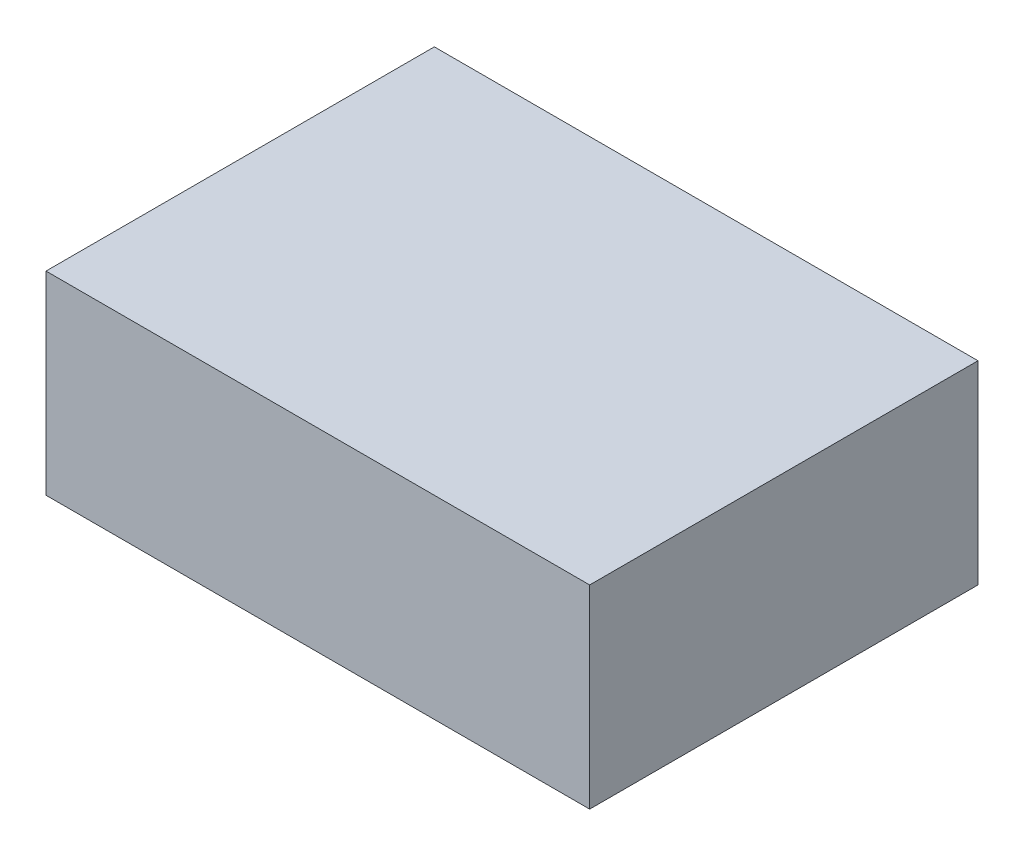
ISO-10303-21;
HEADER;
FILE_DESCRIPTION(('STEP AP214'),'2;1');
FILE_NAME('part.step','',(''),(''),'','','');
FILE_SCHEMA(('AUTOMOTIVE_DESIGN { 1 0 10303 214 1 1 1 1 }'));
ENDSEC;
DATA;
#1=APPLICATION_CONTEXT('core data for automotive mechanical design processes');
#2=APPLICATION_PROTOCOL_DEFINITION('international standard','automotive_design',2000,#1);
#3=PRODUCT_CONTEXT('',#1,'mechanical');
#4=PRODUCT('Part','Part','',(#3));
#5=PRODUCT_RELATED_PRODUCT_CATEGORY('part','',(#4));
#6=PRODUCT_DEFINITION_FORMATION('','',#4);
#7=PRODUCT_DEFINITION_CONTEXT('part definition',#1,'design');
#8=PRODUCT_DEFINITION('design','',#6,#7);
#9=PRODUCT_DEFINITION_SHAPE('','',#8);
#10=(LENGTH_UNIT() NAMED_UNIT(*) SI_UNIT(.MILLI.,.METRE.));
#11=(NAMED_UNIT(*) PLANE_ANGLE_UNIT() SI_UNIT($,.RADIAN.));
#12=(NAMED_UNIT(*) SI_UNIT($,.STERADIAN.) SOLID_ANGLE_UNIT());
#13=UNCERTAINTY_MEASURE_WITH_UNIT(LENGTH_MEASURE(1.E-05),#10,'distance_accuracy_value','');
#14=(GEOMETRIC_REPRESENTATION_CONTEXT(3) GLOBAL_UNCERTAINTY_ASSIGNED_CONTEXT((#13)) GLOBAL_UNIT_ASSIGNED_CONTEXT((#10,
#11,#12)) REPRESENTATION_CONTEXT('',''));
#15=CARTESIAN_POINT('',(0.,0.,0.));
#16=DIRECTION('',(0.,0.,1.));
#17=DIRECTION('',(1.,0.,0.));
#18=AXIS2_PLACEMENT_3D('',#15,#16,#17);
#19=CARTESIAN_POINT('',(0.,2.,0.));
#20=DIRECTION('',(1.,0.,0.));
#21=DIRECTION('',(0.,0.,-1.));
#22=AXIS2_PLACEMENT_3D('',#19,#20,#21);
#23=PLANE('',#22);
#24=DIRECTION('',(0.,0.,1.));
#25=VECTOR('',#24,1.);
#26=CARTESIAN_POINT('',(0.,0.,0.));
#27=LINE('',#26,#25);
#28=CARTESIAN_POINT('',(0.,0.,-4.));
#29=VERTEX_POINT('',#28);
#30=CARTESIAN_POINT('',(0.,0.,0.));
#31=VERTEX_POINT('',#30);
#32=EDGE_CURVE('E98',#29,#31,#27,.T.);
#33=ORIENTED_EDGE('',*,*,#32,.T.);
#34=DIRECTION('',(0.,-1.,0.));
#35=VECTOR('',#34,1.);
#36=CARTESIAN_POINT('',(0.,2.,0.));
#37=LINE('',#36,#35);
#38=CARTESIAN_POINT('',(0.,2.,0.));
#39=VERTEX_POINT('',#38);
#40=EDGE_CURVE('E11',#39,#31,#37,.T.);
#41=ORIENTED_EDGE('',*,*,#40,.F.);
#42=DIRECTION('',(0.,0.,1.));
#43=VECTOR('',#42,1.);
#44=CARTESIAN_POINT('',(0.,2.,0.));
#45=LINE('',#44,#43);
#46=CARTESIAN_POINT('',(0.,2.,-4.));
#47=VERTEX_POINT('',#46);
#48=EDGE_CURVE('E86',#47,#39,#45,.T.);
#49=ORIENTED_EDGE('',*,*,#48,.F.);
#50=DIRECTION('',(0.,-1.,0.));
#51=VECTOR('',#50,1.);
#52=CARTESIAN_POINT('',(0.,2.,-4.));
#53=LINE('',#52,#51);
#54=EDGE_CURVE('E94',#47,#29,#53,.T.);
#55=ORIENTED_EDGE('',*,*,#54,.T.);
#56=EDGE_LOOP('',(#33,#41,#49,#55));
#57=FACE_BOUND('',#56,.T.);
#58=ADVANCED_FACE('F35',(#57),#23,.F.);
#59=CARTESIAN_POINT('',(0.,2.,0.));
#60=DIRECTION('',(0.,0.,-1.));
#61=DIRECTION('',(-1.,0.,0.));
#62=AXIS2_PLACEMENT_3D('',#59,#60,#61);
#63=PLANE('',#62);
#64=DIRECTION('',(1.,0.,0.));
#65=VECTOR('',#64,1.);
#66=CARTESIAN_POINT('',(0.,0.,0.));
#67=LINE('',#66,#65);
#68=CARTESIAN_POINT('',(5.6,0.,0.));
#69=VERTEX_POINT('',#68);
#70=EDGE_CURVE('E90',#31,#69,#67,.T.);
#71=ORIENTED_EDGE('',*,*,#70,.T.);
#72=DIRECTION('',(0.,-1.,0.));
#73=VECTOR('',#72,1.);
#74=CARTESIAN_POINT('',(5.6,2.,0.));
#75=LINE('',#74,#73);
#76=CARTESIAN_POINT('',(5.6,2.,0.));
#77=VERTEX_POINT('',#76);
#78=EDGE_CURVE('E43',#77,#69,#75,.T.);
#79=ORIENTED_EDGE('',*,*,#78,.F.);
#80=DIRECTION('',(1.,0.,0.));
#81=VECTOR('',#80,1.);
#82=CARTESIAN_POINT('',(0.,2.,0.));
#83=LINE('',#82,#81);
#84=EDGE_CURVE('E81',#39,#77,#83,.T.);
#85=ORIENTED_EDGE('',*,*,#84,.F.);
#86=ORIENTED_EDGE('',*,*,#40,.T.);
#87=EDGE_LOOP('',(#71,#79,#85,#86));
#88=FACE_BOUND('',#87,.T.);
#89=ADVANCED_FACE('F89',(#88),#63,.F.);
#90=CARTESIAN_POINT('',(5.6,2.,0.));
#91=DIRECTION('',(-1.,0.,0.));
#92=DIRECTION('',(0.,0.,1.));
#93=AXIS2_PLACEMENT_3D('',#90,#91,#92);
#94=PLANE('',#93);
#95=DIRECTION('',(0.,0.,-1.));
#96=VECTOR('',#95,1.);
#97=CARTESIAN_POINT('',(5.6,0.,0.));
#98=LINE('',#97,#96);
#99=CARTESIAN_POINT('',(5.6,0.,-4.));
#100=VERTEX_POINT('',#99);
#101=EDGE_CURVE('E68',#69,#100,#98,.T.);
#102=ORIENTED_EDGE('',*,*,#101,.T.);
#103=DIRECTION('',(0.,-1.,0.));
#104=VECTOR('',#103,1.);
#105=CARTESIAN_POINT('',(5.6,2.,-4.));
#106=LINE('',#105,#104);
#107=CARTESIAN_POINT('',(5.6,2.,-4.));
#108=VERTEX_POINT('',#107);
#109=EDGE_CURVE('E91',#108,#100,#106,.T.);
#110=ORIENTED_EDGE('',*,*,#109,.F.);
#111=DIRECTION('',(0.,0.,-1.));
#112=VECTOR('',#111,1.);
#113=CARTESIAN_POINT('',(5.6,2.,0.));
#114=LINE('',#113,#112);
#115=EDGE_CURVE('E84',#77,#108,#114,.T.);
#116=ORIENTED_EDGE('',*,*,#115,.F.);
#117=ORIENTED_EDGE('',*,*,#78,.T.);
#118=EDGE_LOOP('',(#102,#110,#116,#117));
#119=FACE_BOUND('',#118,.T.);
#120=ADVANCED_FACE('F92',(#119),#94,.F.);
#121=CARTESIAN_POINT('',(0.,2.,-4.));
#122=DIRECTION('',(0.,0.,1.));
#123=DIRECTION('',(1.,0.,0.));
#124=AXIS2_PLACEMENT_3D('',#121,#122,#123);
#125=PLANE('',#124);
#126=DIRECTION('',(-1.,0.,0.));
#127=VECTOR('',#126,1.);
#128=CARTESIAN_POINT('',(0.,0.,-4.));
#129=LINE('',#128,#127);
#130=EDGE_CURVE('E74',#100,#29,#129,.T.);
#131=ORIENTED_EDGE('',*,*,#130,.T.);
#132=ORIENTED_EDGE('',*,*,#54,.F.);
#133=DIRECTION('',(-1.,0.,0.));
#134=VECTOR('',#133,1.);
#135=CARTESIAN_POINT('',(0.,2.,-4.));
#136=LINE('',#135,#134);
#137=EDGE_CURVE('E51',#108,#47,#136,.T.);
#138=ORIENTED_EDGE('',*,*,#137,.F.);
#139=ORIENTED_EDGE('',*,*,#109,.T.);
#140=EDGE_LOOP('',(#131,#132,#138,#139));
#141=FACE_BOUND('',#140,.T.);
#142=ADVANCED_FACE('F105',(#141),#125,.F.);
#143=CARTESIAN_POINT('',(0.,2.,0.));
#144=DIRECTION('',(0.,-1.,0.));
#145=DIRECTION('',(0.,0.,-1.));
#146=AXIS2_PLACEMENT_3D('',#143,#144,#145);
#147=PLANE('',#146);
#148=ORIENTED_EDGE('',*,*,#48,.T.);
#149=ORIENTED_EDGE('',*,*,#84,.T.);
#150=ORIENTED_EDGE('',*,*,#115,.T.);
#151=ORIENTED_EDGE('',*,*,#137,.T.);
#152=EDGE_LOOP('',(#148,#149,#150,#151));
#153=FACE_BOUND('',#152,.T.);
#154=ADVANCED_FACE('F82',(#153),#147,.F.);
#155=CARTESIAN_POINT('',(0.,0.,0.));
#156=DIRECTION('',(0.,-1.,0.));
#157=DIRECTION('',(0.,0.,-1.));
#158=AXIS2_PLACEMENT_3D('',#155,#156,#157);
#159=PLANE('',#158);
#160=ORIENTED_EDGE('',*,*,#32,.F.);
#161=ORIENTED_EDGE('',*,*,#130,.F.);
#162=ORIENTED_EDGE('',*,*,#101,.F.);
#163=ORIENTED_EDGE('',*,*,#70,.F.);
#164=EDGE_LOOP('',(#160,#161,#162,#163));
#165=FACE_BOUND('',#164,.T.);
#166=ADVANCED_FACE('F108',(#165),#159,.T.);
#167=CLOSED_SHELL('',(#58,#89,#120,#142,#154,#166));
#168=MANIFOLD_SOLID_BREP('B2',#167);
#169=ADVANCED_BREP_SHAPE_REPRESENTATION('',(#18,#168),#14);
#170=SHAPE_DEFINITION_REPRESENTATION(#9,#169);
ENDSEC;
END-ISO-10303-21;
